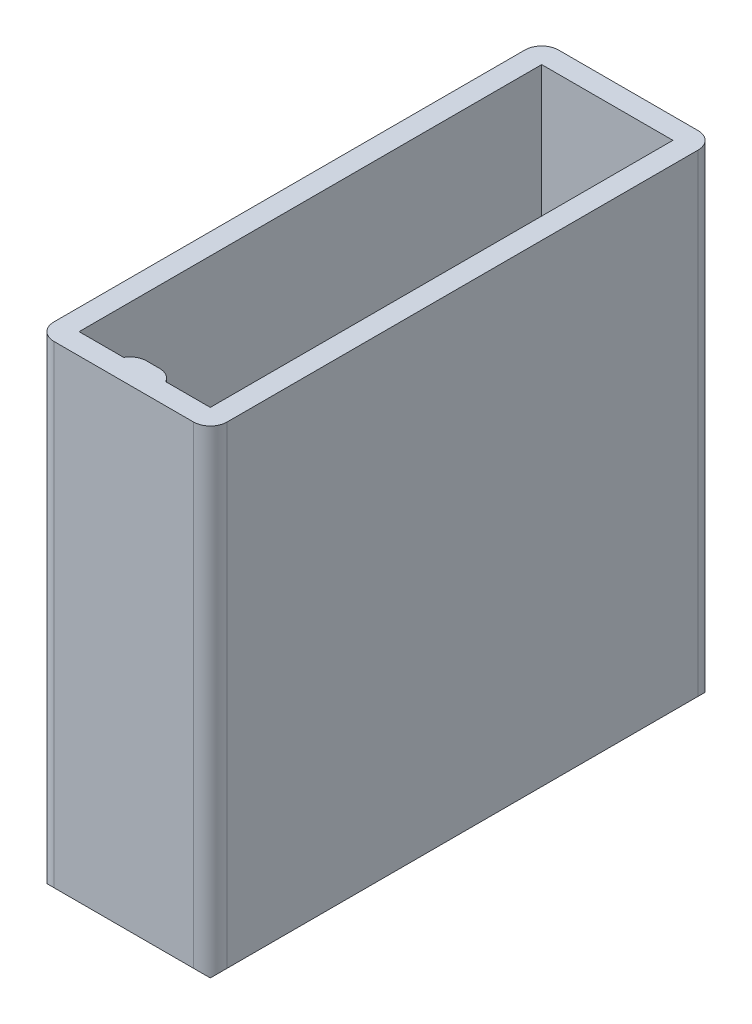
ISO-10303-21;
HEADER;
FILE_DESCRIPTION(('STEP AP214'),'2;1');
FILE_NAME('part.step','',(''),(''),'','','');
FILE_SCHEMA(('AUTOMOTIVE_DESIGN { 1 0 10303 214 1 1 1 1 }'));
ENDSEC;
DATA;
#1=APPLICATION_CONTEXT('core data for automotive mechanical design processes');
#2=APPLICATION_PROTOCOL_DEFINITION('international standard','automotive_design',2000,#1);
#3=PRODUCT_CONTEXT('',#1,'mechanical');
#4=PRODUCT('Part','Part','',(#3));
#5=PRODUCT_RELATED_PRODUCT_CATEGORY('part','',(#4));
#6=PRODUCT_DEFINITION_FORMATION('','',#4);
#7=PRODUCT_DEFINITION_CONTEXT('part definition',#1,'design');
#8=PRODUCT_DEFINITION('design','',#6,#7);
#9=PRODUCT_DEFINITION_SHAPE('','',#8);
#10=(LENGTH_UNIT() NAMED_UNIT(*) SI_UNIT(.MILLI.,.METRE.));
#11=(NAMED_UNIT(*) PLANE_ANGLE_UNIT() SI_UNIT($,.RADIAN.));
#12=(NAMED_UNIT(*) SI_UNIT($,.STERADIAN.) SOLID_ANGLE_UNIT());
#13=UNCERTAINTY_MEASURE_WITH_UNIT(LENGTH_MEASURE(1.E-05),#10,'distance_accuracy_value','');
#14=(GEOMETRIC_REPRESENTATION_CONTEXT(3) GLOBAL_UNCERTAINTY_ASSIGNED_CONTEXT((#13)) GLOBAL_UNIT_ASSIGNED_CONTEXT((#10,
#11,#12)) REPRESENTATION_CONTEXT('',''));
#15=CARTESIAN_POINT('',(0.,0.,0.));
#16=DIRECTION('',(0.,0.,1.));
#17=DIRECTION('',(1.,0.,0.));
#18=AXIS2_PLACEMENT_3D('',#15,#16,#17);
#19=CARTESIAN_POINT('',(-16.6611904761905,-28.6354761904762,34.925));
#20=DIRECTION('',(0.,0.,1.));
#21=DIRECTION('',(1.,0.,0.));
#22=AXIS2_PLACEMENT_3D('',#19,#20,#21);
#23=PLANE('',#22);
#24=DIRECTION('',(0.,-1.,0.));
#25=VECTOR('',#24,1.);
#26=CARTESIAN_POINT('',(-3.58019047619048,44.3895238095238,34.925));
#27=LINE('',#26,#25);
#28=CARTESIAN_POINT('',(-3.58019047619048,44.3895238095238,34.925));
#29=VERTEX_POINT('',#28);
#30=CARTESIAN_POINT('',(-3.58019047619048,43.6021238095238,34.925));
#31=VERTEX_POINT('',#30);
#32=EDGE_CURVE('E208',#29,#31,#27,.T.);
#33=ORIENTED_EDGE('',*,*,#32,.F.);
#34=DIRECTION('',(1.,0.,0.));
#35=VECTOR('',#34,1.);
#36=CARTESIAN_POINT('',(-16.6611904761905,44.3895238095238,34.925));
#37=LINE('',#36,#35);
#38=CARTESIAN_POINT('',(3.15080952380952,44.3895238095238,34.925));
#39=VERTEX_POINT('',#38);
#40=EDGE_CURVE('E202',#29,#39,#37,.T.);
#41=ORIENTED_EDGE('',*,*,#40,.T.);
#42=DIRECTION('',(0.,1.,0.));
#43=VECTOR('',#42,1.);
#44=CARTESIAN_POINT('',(3.15080952380954,-28.6354761904762,34.925));
#45=LINE('',#44,#43);
#46=CARTESIAN_POINT('',(3.15080952380954,-28.6354761904762,34.925));
#47=VERTEX_POINT('',#46);
#48=EDGE_CURVE('E235',#47,#39,#45,.T.);
#49=ORIENTED_EDGE('',*,*,#48,.F.);
#50=DIRECTION('',(1.,0.,0.));
#51=VECTOR('',#50,1.);
#52=CARTESIAN_POINT('',(-16.6611904761905,-28.6354761904762,34.925));
#53=LINE('',#52,#51);
#54=CARTESIAN_POINT('',(-16.6611904761905,-28.6354761904762,34.925));
#55=VERTEX_POINT('',#54);
#56=EDGE_CURVE('E218',#55,#47,#53,.T.);
#57=ORIENTED_EDGE('',*,*,#56,.F.);
#58=DIRECTION('',(0.,1.,0.));
#59=VECTOR('',#58,1.);
#60=CARTESIAN_POINT('',(-16.6611904761905,-28.6354761904762,34.925));
#61=LINE('',#60,#59);
#62=CARTESIAN_POINT('',(-16.6611904761905,44.3895238095238,34.925));
#63=VERTEX_POINT('',#62);
#64=EDGE_CURVE('E199',#55,#63,#61,.T.);
#65=ORIENTED_EDGE('',*,*,#64,.T.);
#66=CARTESIAN_POINT('',(-9.93019047619048,44.3895238095238,34.925));
#67=VERTEX_POINT('',#66);
#68=EDGE_CURVE('E188',#63,#67,#37,.T.);
#69=ORIENTED_EDGE('',*,*,#68,.T.);
#70=DIRECTION('',(0.,1.,0.));
#71=VECTOR('',#70,1.);
#72=CARTESIAN_POINT('',(-9.93019047619048,43.6021238095238,34.925));
#73=LINE('',#72,#71);
#74=CARTESIAN_POINT('',(-9.93019047619048,43.6021238095238,34.925));
#75=VERTEX_POINT('',#74);
#76=EDGE_CURVE('E197',#75,#67,#73,.T.);
#77=ORIENTED_EDGE('',*,*,#76,.F.);
#78=DIRECTION('',(-1.,0.,0.));
#79=VECTOR('',#78,1.);
#80=CARTESIAN_POINT('',(-3.58019047619048,43.6021238095238,34.925));
#81=LINE('',#80,#79);
#82=EDGE_CURVE('E204',#31,#75,#81,.T.);
#83=ORIENTED_EDGE('',*,*,#82,.F.);
#84=EDGE_LOOP('',(#33,#41,#49,#57,#65,#69,#77,#83));
#85=FACE_BOUND('',#84,.T.);
#86=ADVANCED_FACE('F44',(#85),#23,.F.);
#87=CARTESIAN_POINT('',(6.32580952380952,44.3895238095238,38.1));
#88=DIRECTION('',(0.,-1.,0.));
#89=DIRECTION('',(1.,0.,0.));
#90=AXIS2_PLACEMENT_3D('',#87,#88,#89);
#91=PLANE('',#90);
#92=ORIENTED_EDGE('',*,*,#40,.F.);
#93=CARTESIAN_POINT('',(-5.77989500180296,44.3895238095238,36.195));
#94=DIRECTION('',(0.,-1.,0.));
#95=DIRECTION('',(1.,0.,0.));
#96=AXIS2_PLACEMENT_3D('',#93,#94,#95);
#97=CIRCLE('',#96,2.54);
#98=CARTESIAN_POINT('',(-5.77989500180296,44.3895238095238,33.655));
#99=VERTEX_POINT('',#98);
#100=EDGE_CURVE('E11',#29,#99,#97,.F.);
#101=ORIENTED_EDGE('',*,*,#100,.T.);
#102=DIRECTION('',(1.,0.,0.));
#103=VECTOR('',#102,1.);
#104=CARTESIAN_POINT('',(-9.93019047619048,44.3895238095238,33.655));
#105=LINE('',#104,#103);
#106=CARTESIAN_POINT('',(-7.73048595057801,44.3895238095238,33.655));
#107=VERTEX_POINT('',#106);
#108=EDGE_CURVE('E190',#107,#99,#105,.T.);
#109=ORIENTED_EDGE('',*,*,#108,.F.);
#110=CARTESIAN_POINT('',(-7.73048595057801,44.3895238095238,36.195));
#111=DIRECTION('',(0.,-1.,0.));
#112=DIRECTION('',(1.,0.,0.));
#113=AXIS2_PLACEMENT_3D('',#110,#111,#112);
#114=CIRCLE('',#113,2.54);
#115=EDGE_CURVE('E52',#107,#67,#114,.F.);
#116=ORIENTED_EDGE('',*,*,#115,.T.);
#117=ORIENTED_EDGE('',*,*,#68,.F.);
#118=DIRECTION('',(0.,0.,1.));
#119=VECTOR('',#118,1.);
#120=CARTESIAN_POINT('',(-16.6611904761905,44.3895238095238,-34.925));
#121=LINE('',#120,#119);
#122=CARTESIAN_POINT('',(-16.6611904761905,44.3895238095238,-34.925));
#123=VERTEX_POINT('',#122);
#124=EDGE_CURVE('E227',#123,#63,#121,.T.);
#125=ORIENTED_EDGE('',*,*,#124,.F.);
#126=DIRECTION('',(-1.,0.,0.));
#127=VECTOR('',#126,1.);
#128=CARTESIAN_POINT('',(3.15080952380952,44.3895238095238,-34.925));
#129=LINE('',#128,#127);
#130=CARTESIAN_POINT('',(3.15080952380952,44.3895238095238,-34.925));
#131=VERTEX_POINT('',#130);
#132=EDGE_CURVE('E225',#131,#123,#129,.T.);
#133=ORIENTED_EDGE('',*,*,#132,.F.);
#134=DIRECTION('',(0.,0.,-1.));
#135=VECTOR('',#134,1.);
#136=CARTESIAN_POINT('',(3.15080952380952,44.3895238095238,34.925));
#137=LINE('',#136,#135);
#138=EDGE_CURVE('E201',#39,#131,#137,.T.);
#139=ORIENTED_EDGE('',*,*,#138,.F.);
#140=EDGE_LOOP('',(#92,#101,#109,#116,#117,#125,#133,#139));
#141=FACE_BOUND('',#140,.T.);
#142=DIRECTION('',(-1.,0.,0.));
#143=VECTOR('',#142,1.);
#144=CARTESIAN_POINT('',(6.32580952380952,44.3895238095238,-38.1));
#145=LINE('',#144,#143);
#146=CARTESIAN_POINT('',(3.78580952380952,44.3895238095238,-38.1));
#147=VERTEX_POINT('',#146);
#148=CARTESIAN_POINT('',(-17.2961904761905,44.3895238095238,-38.1));
#149=VERTEX_POINT('',#148);
#150=EDGE_CURVE('E234',#147,#149,#145,.T.);
#151=ORIENTED_EDGE('',*,*,#150,.T.);
#152=CARTESIAN_POINT('',(-17.2961904761905,44.3895238095238,-35.56));
#153=DIRECTION('',(0.,-1.,0.));
#154=DIRECTION('',(1.,0.,0.));
#155=AXIS2_PLACEMENT_3D('',#152,#153,#154);
#156=CIRCLE('',#155,2.54);
#157=CARTESIAN_POINT('',(-19.8361904761905,44.3895238095238,-35.56));
#158=VERTEX_POINT('',#157);
#159=EDGE_CURVE('E306',#149,#158,#156,.F.);
#160=ORIENTED_EDGE('',*,*,#159,.T.);
#161=DIRECTION('',(0.,0.,-1.));
#162=VECTOR('',#161,1.);
#163=CARTESIAN_POINT('',(-19.8361904761905,44.3895238095238,38.1));
#164=LINE('',#163,#162);
#165=CARTESIAN_POINT('',(-19.8361904761905,44.3895238095238,35.56));
#166=VERTEX_POINT('',#165);
#167=EDGE_CURVE('E249',#166,#158,#164,.T.);
#168=ORIENTED_EDGE('',*,*,#167,.F.);
#169=CARTESIAN_POINT('',(-17.2961904761905,44.3895238095238,35.56));
#170=DIRECTION('',(0.,-1.,0.));
#171=DIRECTION('',(1.,0.,0.));
#172=AXIS2_PLACEMENT_3D('',#169,#170,#171);
#173=CIRCLE('',#172,2.54);
#174=CARTESIAN_POINT('',(-17.2961904761905,44.3895238095238,38.1));
#175=VERTEX_POINT('',#174);
#176=EDGE_CURVE('E300',#166,#175,#173,.F.);
#177=ORIENTED_EDGE('',*,*,#176,.T.);
#178=DIRECTION('',(-1.,0.,0.));
#179=VECTOR('',#178,1.);
#180=CARTESIAN_POINT('',(6.32580952380952,44.3895238095238,38.1));
#181=LINE('',#180,#179);
#182=CARTESIAN_POINT('',(3.78580952380952,44.3895238095238,38.1));
#183=VERTEX_POINT('',#182);
#184=EDGE_CURVE('E241',#183,#175,#181,.T.);
#185=ORIENTED_EDGE('',*,*,#184,.F.);
#186=CARTESIAN_POINT('',(3.78580952380952,44.3895238095238,35.56));
#187=DIRECTION('',(0.,-1.,0.));
#188=DIRECTION('',(1.,0.,0.));
#189=AXIS2_PLACEMENT_3D('',#186,#187,#188);
#190=CIRCLE('',#189,2.54);
#191=CARTESIAN_POINT('',(6.32580952380952,44.3895238095238,35.56));
#192=VERTEX_POINT('',#191);
#193=EDGE_CURVE('E302',#183,#192,#190,.F.);
#194=ORIENTED_EDGE('',*,*,#193,.T.);
#195=DIRECTION('',(0.,0.,-1.));
#196=VECTOR('',#195,1.);
#197=CARTESIAN_POINT('',(6.32580952380952,44.3895238095238,38.1));
#198=LINE('',#197,#196);
#199=CARTESIAN_POINT('',(6.32580952380952,44.3895238095238,-35.56));
#200=VERTEX_POINT('',#199);
#201=EDGE_CURVE('E244',#192,#200,#198,.T.);
#202=ORIENTED_EDGE('',*,*,#201,.T.);
#203=CARTESIAN_POINT('',(3.78580952380952,44.3895238095238,-35.56));
#204=DIRECTION('',(0.,-1.,0.));
#205=DIRECTION('',(1.,0.,0.));
#206=AXIS2_PLACEMENT_3D('',#203,#204,#205);
#207=CIRCLE('',#206,2.54);
#208=EDGE_CURVE('E304',#200,#147,#207,.F.);
#209=ORIENTED_EDGE('',*,*,#208,.T.);
#210=EDGE_LOOP('',(#151,#160,#168,#177,#185,#194,#202,#209));
#211=FACE_BOUND('',#210,.T.);
#212=ADVANCED_FACE('F185',(#141,#211),#91,.F.);
#213=CARTESIAN_POINT('',(-19.8361904761905,44.3895238095238,38.1));
#214=DIRECTION('',(1.,0.,0.));
#215=DIRECTION('',(0.,0.,-1.));
#216=AXIS2_PLACEMENT_3D('',#213,#214,#215);
#217=PLANE('',#216);
#218=ORIENTED_EDGE('',*,*,#167,.T.);
#219=DIRECTION('',(0.,-1.,0.));
#220=VECTOR('',#219,1.);
#221=CARTESIAN_POINT('',(-19.8361904761905,44.3895238095238,-35.56));
#222=LINE('',#221,#220);
#223=CARTESIAN_POINT('',(-19.8361904761905,-27.0479761904762,-35.56));
#224=VERTEX_POINT('',#223);
#225=EDGE_CURVE('E285',#158,#224,#222,.T.);
#226=ORIENTED_EDGE('',*,*,#225,.T.);
#227=DIRECTION('',(0.,0.,1.));
#228=VECTOR('',#227,1.);
#229=CARTESIAN_POINT('',(-19.8361904761905,-27.0479761904762,38.1));
#230=LINE('',#229,#228);
#231=CARTESIAN_POINT('',(-19.8361904761905,-27.0479761904762,35.56));
#232=VERTEX_POINT('',#231);
#233=EDGE_CURVE('E262',#224,#232,#230,.T.);
#234=ORIENTED_EDGE('',*,*,#233,.T.);
#235=DIRECTION('',(0.,-1.,0.));
#236=VECTOR('',#235,1.);
#237=CARTESIAN_POINT('',(-19.8361904761905,44.3895238095238,35.56));
#238=LINE('',#237,#236);
#239=EDGE_CURVE('E274',#232,#166,#238,.F.);
#240=ORIENTED_EDGE('',*,*,#239,.T.);
#241=EDGE_LOOP('',(#218,#226,#234,#240));
#242=FACE_BOUND('',#241,.T.);
#243=ADVANCED_FACE('F357',(#242),#217,.F.);
#244=CARTESIAN_POINT('',(-19.8361904761905,-31.8104761904762,38.1));
#245=DIRECTION('',(0.,1.,0.));
#246=DIRECTION('',(0.,0.,1.));
#247=AXIS2_PLACEMENT_3D('',#244,#245,#246);
#248=PLANE('',#247);
#249=DIRECTION('',(-1.,0.,0.));
#250=VECTOR('',#249,1.);
#251=CARTESIAN_POINT('',(-19.8361904761905,-31.8104761904762,33.3375));
#252=LINE('',#251,#250);
#253=CARTESIAN_POINT('',(1.5633095238095,-31.8104761904762,33.3375));
#254=VERTEX_POINT('',#253);
#255=CARTESIAN_POINT('',(-15.0736904761905,-31.8104761904762,33.3375));
#256=VERTEX_POINT('',#255);
#257=EDGE_CURVE('E252',#254,#256,#252,.T.);
#258=ORIENTED_EDGE('',*,*,#257,.T.);
#259=DIRECTION('',(0.,0.,-1.));
#260=VECTOR('',#259,1.);
#261=CARTESIAN_POINT('',(-15.0736904761905,-31.8104761904762,38.1));
#262=LINE('',#261,#260);
#263=CARTESIAN_POINT('',(-15.0736904761905,-31.8104761904762,-33.3375));
#264=VERTEX_POINT('',#263);
#265=EDGE_CURVE('E259',#256,#264,#262,.T.);
#266=ORIENTED_EDGE('',*,*,#265,.T.);
#267=DIRECTION('',(1.,0.,0.));
#268=VECTOR('',#267,1.);
#269=CARTESIAN_POINT('',(-19.8361904761905,-31.8104761904762,-33.3375));
#270=LINE('',#269,#268);
#271=CARTESIAN_POINT('',(1.5633095238095,-31.8104761904762,-33.3375));
#272=VERTEX_POINT('',#271);
#273=EDGE_CURVE('E256',#264,#272,#270,.T.);
#274=ORIENTED_EDGE('',*,*,#273,.T.);
#275=DIRECTION('',(0.,0.,1.));
#276=VECTOR('',#275,1.);
#277=CARTESIAN_POINT('',(1.5633095238095,-31.8104761904762,38.1));
#278=LINE('',#277,#276);
#279=EDGE_CURVE('E254',#272,#254,#278,.T.);
#280=ORIENTED_EDGE('',*,*,#279,.T.);
#281=EDGE_LOOP('',(#258,#266,#274,#280));
#282=FACE_BOUND('',#281,.T.);
#283=ADVANCED_FACE('F383',(#282),#248,.F.);
#284=CARTESIAN_POINT('',(6.32580952380952,-31.8104761904762,38.1));
#285=DIRECTION('',(-1.,0.,0.));
#286=DIRECTION('',(0.,-1.,0.));
#287=AXIS2_PLACEMENT_3D('',#284,#285,#286);
#288=PLANE('',#287);
#289=DIRECTION('',(0.,0.,-1.));
#290=VECTOR('',#289,1.);
#291=CARTESIAN_POINT('',(6.32580952380952,-27.0479761904762,38.1));
#292=LINE('',#291,#290);
#293=CARTESIAN_POINT('',(6.32580952380952,-27.0479761904762,35.56));
#294=VERTEX_POINT('',#293);
#295=CARTESIAN_POINT('',(6.32580952380952,-27.0479761904762,-35.56));
#296=VERTEX_POINT('',#295);
#297=EDGE_CURVE('E268',#294,#296,#292,.T.);
#298=ORIENTED_EDGE('',*,*,#297,.T.);
#299=DIRECTION('',(0.,1.,0.));
#300=VECTOR('',#299,1.);
#301=CARTESIAN_POINT('',(6.32580952380952,-31.8104761904762,-35.56));
#302=LINE('',#301,#300);
#303=EDGE_CURVE('E310',#296,#200,#302,.T.);
#304=ORIENTED_EDGE('',*,*,#303,.T.);
#305=ORIENTED_EDGE('',*,*,#201,.F.);
#306=DIRECTION('',(0.,1.,0.));
#307=VECTOR('',#306,1.);
#308=CARTESIAN_POINT('',(6.32580952380952,-27.0479761904762,35.56));
#309=LINE('',#308,#307);
#310=EDGE_CURVE('E308',#192,#294,#309,.F.);
#311=ORIENTED_EDGE('',*,*,#310,.T.);
#312=EDGE_LOOP('',(#298,#304,#305,#311));
#313=FACE_BOUND('',#312,.T.);
#314=ADVANCED_FACE('F376',(#313),#288,.F.);
#315=CARTESIAN_POINT('',(0.,0.,38.1));
#316=DIRECTION('',(0.,0.,1.));
#317=DIRECTION('',(1.,0.,0.));
#318=AXIS2_PLACEMENT_3D('',#315,#316,#317);
#319=PLANE('',#318);
#320=DIRECTION('',(1.,0.,0.));
#321=VECTOR('',#320,1.);
#322=CARTESIAN_POINT('',(6.32580952380952,-27.0479761904762,38.1));
#323=LINE('',#322,#321);
#324=CARTESIAN_POINT('',(-17.2961904761905,-27.0479761904762,38.1));
#325=VERTEX_POINT('',#324);
#326=CARTESIAN_POINT('',(3.78580952380952,-27.0479761904762,38.1));
#327=VERTEX_POINT('',#326);
#328=EDGE_CURVE('E271',#325,#327,#323,.T.);
#329=ORIENTED_EDGE('',*,*,#328,.T.);
#330=DIRECTION('',(0.,1.,0.));
#331=VECTOR('',#330,1.);
#332=CARTESIAN_POINT('',(3.78580952380952,44.3895238095238,38.1));
#333=LINE('',#332,#331);
#334=EDGE_CURVE('E320',#327,#183,#333,.T.);
#335=ORIENTED_EDGE('',*,*,#334,.T.);
#336=ORIENTED_EDGE('',*,*,#184,.T.);
#337=DIRECTION('',(0.,-1.,0.));
#338=VECTOR('',#337,1.);
#339=CARTESIAN_POINT('',(-17.2961904761905,-27.0479761904762,38.1));
#340=LINE('',#339,#338);
#341=EDGE_CURVE('E317',#175,#325,#340,.T.);
#342=ORIENTED_EDGE('',*,*,#341,.T.);
#343=EDGE_LOOP('',(#329,#335,#336,#342));
#344=FACE_BOUND('',#343,.T.);
#345=ADVANCED_FACE('F373',(#344),#319,.T.);
#346=CARTESIAN_POINT('',(0.,0.,-38.1));
#347=DIRECTION('',(0.,0.,1.));
#348=DIRECTION('',(1.,0.,0.));
#349=AXIS2_PLACEMENT_3D('',#346,#347,#348);
#350=PLANE('',#349);
#351=DIRECTION('',(-1.,0.,0.));
#352=VECTOR('',#351,1.);
#353=CARTESIAN_POINT('',(0.,-27.0479761904762,-38.1));
#354=LINE('',#353,#352);
#355=CARTESIAN_POINT('',(3.78580952380952,-27.0479761904762,-38.1));
#356=VERTEX_POINT('',#355);
#357=CARTESIAN_POINT('',(-17.2961904761905,-27.0479761904762,-38.1));
#358=VERTEX_POINT('',#357);
#359=EDGE_CURVE('E265',#356,#358,#354,.T.);
#360=ORIENTED_EDGE('',*,*,#359,.T.);
#361=DIRECTION('',(0.,-1.,0.));
#362=VECTOR('',#361,1.);
#363=CARTESIAN_POINT('',(-17.2961904761905,0.,-38.1));
#364=LINE('',#363,#362);
#365=EDGE_CURVE('E298',#358,#149,#364,.F.);
#366=ORIENTED_EDGE('',*,*,#365,.T.);
#367=ORIENTED_EDGE('',*,*,#150,.F.);
#368=DIRECTION('',(0.,1.,0.));
#369=VECTOR('',#368,1.);
#370=CARTESIAN_POINT('',(3.78580952380952,0.,-38.1));
#371=LINE('',#370,#369);
#372=EDGE_CURVE('E296',#147,#356,#371,.F.);
#373=ORIENTED_EDGE('',*,*,#372,.T.);
#374=EDGE_LOOP('',(#360,#366,#367,#373));
#375=FACE_BOUND('',#374,.T.);
#376=ADVANCED_FACE('F371',(#375),#350,.F.);
#377=CARTESIAN_POINT('',(3.15080952380954,-28.6354761904762,-34.925));
#378=DIRECTION('',(0.,0.,-1.));
#379=DIRECTION('',(-1.,0.,0.));
#380=AXIS2_PLACEMENT_3D('',#377,#378,#379);
#381=PLANE('',#380);
#382=ORIENTED_EDGE('',*,*,#132,.T.);
#383=DIRECTION('',(0.,1.,0.));
#384=VECTOR('',#383,1.);
#385=CARTESIAN_POINT('',(-16.6611904761905,-28.6354761904762,-34.925));
#386=LINE('',#385,#384);
#387=CARTESIAN_POINT('',(-16.6611904761905,-28.6354761904762,-34.925));
#388=VERTEX_POINT('',#387);
#389=EDGE_CURVE('E224',#388,#123,#386,.T.);
#390=ORIENTED_EDGE('',*,*,#389,.F.);
#391=DIRECTION('',(-1.,0.,0.));
#392=VECTOR('',#391,1.);
#393=CARTESIAN_POINT('',(3.15080952380954,-28.6354761904762,-34.925));
#394=LINE('',#393,#392);
#395=CARTESIAN_POINT('',(3.15080952380954,-28.6354761904762,-34.925));
#396=VERTEX_POINT('',#395);
#397=EDGE_CURVE('E212',#396,#388,#394,.T.);
#398=ORIENTED_EDGE('',*,*,#397,.F.);
#399=DIRECTION('',(0.,1.,0.));
#400=VECTOR('',#399,1.);
#401=CARTESIAN_POINT('',(3.15080952380954,-28.6354761904762,-34.925));
#402=LINE('',#401,#400);
#403=EDGE_CURVE('E232',#396,#131,#402,.T.);
#404=ORIENTED_EDGE('',*,*,#403,.T.);
#405=EDGE_LOOP('',(#382,#390,#398,#404));
#406=FACE_BOUND('',#405,.T.);
#407=ADVANCED_FACE('F368',(#406),#381,.F.);
#408=CARTESIAN_POINT('',(3.15080952380954,-28.6354761904762,34.925));
#409=DIRECTION('',(1.,0.,0.));
#410=DIRECTION('',(0.,1.,0.));
#411=AXIS2_PLACEMENT_3D('',#408,#409,#410);
#412=PLANE('',#411);
#413=ORIENTED_EDGE('',*,*,#138,.T.);
#414=ORIENTED_EDGE('',*,*,#403,.F.);
#415=DIRECTION('',(0.,0.,-1.));
#416=VECTOR('',#415,1.);
#417=CARTESIAN_POINT('',(3.15080952380954,-28.6354761904762,34.925));
#418=LINE('',#417,#416);
#419=EDGE_CURVE('E221',#47,#396,#418,.T.);
#420=ORIENTED_EDGE('',*,*,#419,.F.);
#421=ORIENTED_EDGE('',*,*,#48,.T.);
#422=EDGE_LOOP('',(#413,#414,#420,#421));
#423=FACE_BOUND('',#422,.T.);
#424=ADVANCED_FACE('F361',(#423),#412,.F.);
#425=CARTESIAN_POINT('',(-16.6611904761905,-28.6354761904762,-34.925));
#426=DIRECTION('',(-1.,0.,0.));
#427=DIRECTION('',(0.,-1.,0.));
#428=AXIS2_PLACEMENT_3D('',#425,#426,#427);
#429=PLANE('',#428);
#430=ORIENTED_EDGE('',*,*,#124,.T.);
#431=ORIENTED_EDGE('',*,*,#64,.F.);
#432=DIRECTION('',(0.,0.,1.));
#433=VECTOR('',#432,1.);
#434=CARTESIAN_POINT('',(-16.6611904761905,-28.6354761904762,-34.925));
#435=LINE('',#434,#433);
#436=EDGE_CURVE('E215',#388,#55,#435,.T.);
#437=ORIENTED_EDGE('',*,*,#436,.F.);
#438=ORIENTED_EDGE('',*,*,#389,.T.);
#439=EDGE_LOOP('',(#430,#431,#437,#438));
#440=FACE_BOUND('',#439,.T.);
#441=ADVANCED_FACE('F363',(#440),#429,.F.);
#442=CARTESIAN_POINT('',(0.,-28.6354761904762,0.));
#443=DIRECTION('',(0.,1.,0.));
#444=DIRECTION('',(-1.,0.,0.));
#445=AXIS2_PLACEMENT_3D('',#442,#443,#444);
#446=PLANE('',#445);
#447=ORIENTED_EDGE('',*,*,#397,.T.);
#448=ORIENTED_EDGE('',*,*,#436,.T.);
#449=ORIENTED_EDGE('',*,*,#56,.T.);
#450=ORIENTED_EDGE('',*,*,#419,.T.);
#451=EDGE_LOOP('',(#447,#448,#449,#450));
#452=FACE_BOUND('',#451,.T.);
#453=ADVANCED_FACE('F366',(#452),#446,.T.);
#454=CARTESIAN_POINT('',(6.32580952380952,-27.0479761904762,38.1));
#455=DIRECTION('',(-0.707106781186547,0.707106781186549,0.));
#456=DIRECTION('',(0.,0.,-1.));
#457=AXIS2_PLACEMENT_3D('',#454,#455,#456);
#458=PLANE('',#457);
#459=DIRECTION('',(0.577350269189626,0.577350269189625,-0.577350269189626));
#460=VECTOR('',#459,1.);
#461=CARTESIAN_POINT('',(-19.0741904761905,-52.4479761904762,-12.7));
#462=LINE('',#461,#460);
#463=CARTESIAN_POINT('',(5.58186074802335,-27.7919249662624,-37.3560512242138));
#464=VERTEX_POINT('',#463);
#465=EDGE_CURVE('E280',#464,#272,#462,.F.);
#466=ORIENTED_EDGE('',*,*,#465,.F.);
#467=CARTESIAN_POINT('',(3.78580952380952,-29.5879761904762,-35.56));
#468=DIRECTION('',(-0.707106781186547,0.707106781186549,0.));
#469=DIRECTION('',(0.707106781186549,0.707106781186547,0.));
#470=AXIS2_PLACEMENT_3D('',#467,#468,#469);
#471=ELLIPSE('',#470,3.59210244842766,2.54);
#472=EDGE_CURVE('E315',#464,#296,#471,.F.);
#473=ORIENTED_EDGE('',*,*,#472,.T.);
#474=ORIENTED_EDGE('',*,*,#297,.F.);
#475=CARTESIAN_POINT('',(3.78580952380952,-29.5879761904762,35.56));
#476=DIRECTION('',(-0.707106781186547,0.707106781186549,0.));
#477=DIRECTION('',(-0.707106781186549,-0.707106781186547,0.));
#478=AXIS2_PLACEMENT_3D('',#475,#476,#477);
#479=ELLIPSE('',#478,3.59210244842766,2.54);
#480=CARTESIAN_POINT('',(5.58186074802335,-27.7919249662624,37.3560512242138));
#481=VERTEX_POINT('',#480);
#482=EDGE_CURVE('E313',#294,#481,#479,.F.);
#483=ORIENTED_EDGE('',*,*,#482,.T.);
#484=DIRECTION('',(-0.577350269189626,-0.577350269189625,-0.577350269189626));
#485=VECTOR('',#484,1.);
#486=CARTESIAN_POINT('',(4.21720634920634,-29.1565793650794,35.9913968253968));
#487=LINE('',#486,#485);
#488=EDGE_CURVE('E228',#254,#481,#487,.F.);
#489=ORIENTED_EDGE('',*,*,#488,.F.);
#490=ORIENTED_EDGE('',*,*,#279,.F.);
#491=EDGE_LOOP('',(#466,#473,#474,#483,#489,#490));
#492=FACE_BOUND('',#491,.T.);
#493=ADVANCED_FACE('F411',(#492),#458,.F.);
#494=CARTESIAN_POINT('',(0.,-27.0479761904762,38.1));
#495=DIRECTION('',(0.,-0.707106781186549,0.707106781186547));
#496=DIRECTION('',(-1.,0.,0.));
#497=AXIS2_PLACEMENT_3D('',#494,#495,#496);
#498=PLANE('',#497);
#499=ORIENTED_EDGE('',*,*,#488,.T.);
#500=CARTESIAN_POINT('',(3.78580952380952,-29.5879761904762,35.56));
#501=DIRECTION('',(0.,-0.707106781186549,0.707106781186547));
#502=DIRECTION('',(0.,-0.707106781186547,-0.707106781186549));
#503=AXIS2_PLACEMENT_3D('',#500,#501,#502);
#504=ELLIPSE('',#503,3.59210244842766,2.54);
#505=EDGE_CURVE('E325',#481,#327,#504,.T.);
#506=ORIENTED_EDGE('',*,*,#505,.T.);
#507=ORIENTED_EDGE('',*,*,#328,.F.);
#508=CARTESIAN_POINT('',(-17.2961904761905,-29.5879761904762,35.56));
#509=DIRECTION('',(0.,-0.707106781186549,0.707106781186547));
#510=DIRECTION('',(0.,0.707106781186547,0.707106781186549));
#511=AXIS2_PLACEMENT_3D('',#508,#509,#510);
#512=ELLIPSE('',#511,3.59210244842766,2.54);
#513=CARTESIAN_POINT('',(-19.0922417004043,-27.7919249662624,37.3560512242138));
#514=VERTEX_POINT('',#513);
#515=EDGE_CURVE('E323',#325,#514,#512,.T.);
#516=ORIENTED_EDGE('',*,*,#515,.T.);
#517=DIRECTION('',(-0.577350269189626,0.577350269189625,0.577350269189626));
#518=VECTOR('',#517,1.);
#519=CARTESIAN_POINT('',(-13.224126984127,-33.6600396825397,31.4879365079365));
#520=LINE('',#519,#518);
#521=EDGE_CURVE('E277',#256,#514,#520,.T.);
#522=ORIENTED_EDGE('',*,*,#521,.F.);
#523=ORIENTED_EDGE('',*,*,#257,.F.);
#524=EDGE_LOOP('',(#499,#506,#507,#516,#522,#523));
#525=FACE_BOUND('',#524,.T.);
#526=ADVANCED_FACE('F404',(#525),#498,.T.);
#527=CARTESIAN_POINT('',(-19.8361904761905,-31.8104761904762,-33.3375));
#528=DIRECTION('',(0.,0.707106781186549,0.707106781186547));
#529=DIRECTION('',(1.,0.,0.));
#530=AXIS2_PLACEMENT_3D('',#527,#528,#529);
#531=PLANE('',#530);
#532=DIRECTION('',(-0.577350269189626,0.577350269189625,-0.577350269189626));
#533=VECTOR('',#532,1.);
#534=CARTESIAN_POINT('',(-16.6611904761905,-30.2229761904762,-34.925));
#535=LINE('',#534,#533);
#536=CARTESIAN_POINT('',(-19.0922417004043,-27.7919249662624,-37.3560512242138));
#537=VERTEX_POINT('',#536);
#538=EDGE_CURVE('E275',#537,#264,#535,.F.);
#539=ORIENTED_EDGE('',*,*,#538,.F.);
#540=CARTESIAN_POINT('',(-17.2961904761905,-29.5879761904762,-35.56));
#541=DIRECTION('',(0.,0.707106781186549,0.707106781186547));
#542=DIRECTION('',(0.,-0.707106781186547,0.707106781186549));
#543=AXIS2_PLACEMENT_3D('',#540,#541,#542);
#544=ELLIPSE('',#543,3.59210244842766,2.54);
#545=EDGE_CURVE('E294',#537,#358,#544,.F.);
#546=ORIENTED_EDGE('',*,*,#545,.T.);
#547=ORIENTED_EDGE('',*,*,#359,.F.);
#548=CARTESIAN_POINT('',(3.78580952380952,-29.5879761904762,-35.56));
#549=DIRECTION('',(0.,0.707106781186549,0.707106781186547));
#550=DIRECTION('',(0.,0.707106781186547,-0.707106781186549));
#551=AXIS2_PLACEMENT_3D('',#548,#549,#550);
#552=ELLIPSE('',#551,3.59210244842766,2.54);
#553=EDGE_CURVE('E292',#356,#464,#552,.F.);
#554=ORIENTED_EDGE('',*,*,#553,.T.);
#555=ORIENTED_EDGE('',*,*,#465,.T.);
#556=ORIENTED_EDGE('',*,*,#273,.F.);
#557=EDGE_LOOP('',(#539,#546,#547,#554,#555,#556));
#558=FACE_BOUND('',#557,.T.);
#559=ADVANCED_FACE('F397',(#558),#531,.F.);
#560=CARTESIAN_POINT('',(-15.0736904761905,-31.8104761904762,38.1));
#561=DIRECTION('',(0.707106781186547,0.707106781186549,0.));
#562=DIRECTION('',(0.,0.,-1.));
#563=AXIS2_PLACEMENT_3D('',#560,#561,#562);
#564=PLANE('',#563);
#565=ORIENTED_EDGE('',*,*,#233,.F.);
#566=CARTESIAN_POINT('',(-17.2961904761905,-29.5879761904762,-35.56));
#567=DIRECTION('',(0.707106781186547,0.707106781186549,0.));
#568=DIRECTION('',(0.707106781186549,-0.707106781186547,0.));
#569=AXIS2_PLACEMENT_3D('',#566,#567,#568);
#570=ELLIPSE('',#569,3.59210244842766,2.54);
#571=EDGE_CURVE('E290',#224,#537,#570,.F.);
#572=ORIENTED_EDGE('',*,*,#571,.T.);
#573=ORIENTED_EDGE('',*,*,#538,.T.);
#574=ORIENTED_EDGE('',*,*,#265,.F.);
#575=ORIENTED_EDGE('',*,*,#521,.T.);
#576=CARTESIAN_POINT('',(-17.2961904761905,-29.5879761904762,35.56));
#577=DIRECTION('',(0.707106781186547,0.707106781186549,0.));
#578=DIRECTION('',(-0.707106781186549,0.707106781186547,0.));
#579=AXIS2_PLACEMENT_3D('',#576,#577,#578);
#580=ELLIPSE('',#579,3.59210244842766,2.54);
#581=EDGE_CURVE('E288',#514,#232,#580,.F.);
#582=ORIENTED_EDGE('',*,*,#581,.T.);
#583=EDGE_LOOP('',(#565,#572,#573,#574,#575,#582));
#584=FACE_BOUND('',#583,.T.);
#585=ADVANCED_FACE('F349',(#584),#564,.F.);
#586=CARTESIAN_POINT('',(-3.58019047619048,43.6021238095238,33.655));
#587=DIRECTION('',(0.,1.,0.));
#588=DIRECTION('',(0.,0.,1.));
#589=AXIS2_PLACEMENT_3D('',#586,#587,#588);
#590=PLANE('',#589);
#591=DIRECTION('',(-1.,0.,0.));
#592=VECTOR('',#591,1.);
#593=CARTESIAN_POINT('',(-3.58019047619048,43.6021238095238,33.655));
#594=LINE('',#593,#592);
#595=CARTESIAN_POINT('',(-5.77989500180296,43.6021238095238,33.655));
#596=VERTEX_POINT('',#595);
#597=CARTESIAN_POINT('',(-7.73048595057801,43.6021238095238,33.655));
#598=VERTEX_POINT('',#597);
#599=EDGE_CURVE('E206',#596,#598,#594,.T.);
#600=ORIENTED_EDGE('',*,*,#599,.F.);
#601=CARTESIAN_POINT('',(-5.77989500180296,43.6021238095238,36.195));
#602=DIRECTION('',(0.,1.,0.));
#603=DIRECTION('',(0.,0.,1.));
#604=AXIS2_PLACEMENT_3D('',#601,#602,#603);
#605=CIRCLE('',#604,2.54);
#606=EDGE_CURVE('E67',#596,#31,#605,.F.);
#607=ORIENTED_EDGE('',*,*,#606,.T.);
#608=ORIENTED_EDGE('',*,*,#82,.T.);
#609=CARTESIAN_POINT('',(-7.73048595057801,43.6021238095238,36.195));
#610=DIRECTION('',(0.,1.,0.));
#611=DIRECTION('',(0.,0.,1.));
#612=AXIS2_PLACEMENT_3D('',#609,#610,#611);
#613=CIRCLE('',#612,2.54);
#614=EDGE_CURVE('E59',#75,#598,#613,.F.);
#615=ORIENTED_EDGE('',*,*,#614,.T.);
#616=EDGE_LOOP('',(#600,#607,#608,#615));
#617=FACE_BOUND('',#616,.T.);
#618=ADVANCED_FACE('F332',(#617),#590,.F.);
#619=CARTESIAN_POINT('',(0.,0.,33.655));
#620=DIRECTION('',(0.,0.,-1.));
#621=DIRECTION('',(-1.,0.,0.));
#622=AXIS2_PLACEMENT_3D('',#619,#620,#621);
#623=PLANE('',#622);
#624=ORIENTED_EDGE('',*,*,#108,.T.);
#625=DIRECTION('',(0.,-1.,0.));
#626=VECTOR('',#625,1.);
#627=CARTESIAN_POINT('',(-5.77989500180296,43.6021238095238,33.655));
#628=LINE('',#627,#626);
#629=EDGE_CURVE('E329',#99,#596,#628,.T.);
#630=ORIENTED_EDGE('',*,*,#629,.T.);
#631=ORIENTED_EDGE('',*,*,#599,.T.);
#632=DIRECTION('',(0.,1.,0.));
#633=VECTOR('',#632,1.);
#634=CARTESIAN_POINT('',(-7.73048595057801,44.3895238095238,33.655));
#635=LINE('',#634,#633);
#636=EDGE_CURVE('E327',#598,#107,#635,.T.);
#637=ORIENTED_EDGE('',*,*,#636,.T.);
#638=EDGE_LOOP('',(#624,#630,#631,#637));
#639=FACE_BOUND('',#638,.T.);
#640=ADVANCED_FACE('F337',(#639),#623,.T.);
#641=CARTESIAN_POINT('',(-17.2961904761905,44.3895238095238,-35.56));
#642=DIRECTION('',(0.,-1.,0.));
#643=DIRECTION('',(0.,0.,-1.));
#644=AXIS2_PLACEMENT_3D('',#641,#642,#643);
#645=CYLINDRICAL_SURFACE('',#644,2.54);
#646=ORIENTED_EDGE('',*,*,#159,.F.);
#647=ORIENTED_EDGE('',*,*,#365,.F.);
#648=ORIENTED_EDGE('',*,*,#545,.F.);
#649=ORIENTED_EDGE('',*,*,#571,.F.);
#650=ORIENTED_EDGE('',*,*,#225,.F.);
#651=EDGE_LOOP('',(#646,#647,#648,#649,#650));
#652=FACE_BOUND('',#651,.T.);
#653=ADVANCED_FACE('F339',(#652),#645,.T.);
#654=CARTESIAN_POINT('',(3.78580952380952,-31.8104761904762,-35.56));
#655=DIRECTION('',(0.,1.,0.));
#656=DIRECTION('',(-1.,0.,0.));
#657=AXIS2_PLACEMENT_3D('',#654,#655,#656);
#658=CYLINDRICAL_SURFACE('',#657,2.54);
#659=ORIENTED_EDGE('',*,*,#553,.F.);
#660=ORIENTED_EDGE('',*,*,#372,.F.);
#661=ORIENTED_EDGE('',*,*,#208,.F.);
#662=ORIENTED_EDGE('',*,*,#303,.F.);
#663=ORIENTED_EDGE('',*,*,#472,.F.);
#664=EDGE_LOOP('',(#659,#660,#661,#662,#663));
#665=FACE_BOUND('',#664,.T.);
#666=ADVANCED_FACE('F346',(#665),#658,.T.);
#667=CARTESIAN_POINT('',(3.78580952380952,0.,35.56));
#668=DIRECTION('',(0.,-1.,0.));
#669=DIRECTION('',(1.,0.,0.));
#670=AXIS2_PLACEMENT_3D('',#667,#668,#669);
#671=CYLINDRICAL_SURFACE('',#670,2.54);
#672=ORIENTED_EDGE('',*,*,#482,.F.);
#673=ORIENTED_EDGE('',*,*,#310,.F.);
#674=ORIENTED_EDGE('',*,*,#193,.F.);
#675=ORIENTED_EDGE('',*,*,#334,.F.);
#676=ORIENTED_EDGE('',*,*,#505,.F.);
#677=EDGE_LOOP('',(#672,#673,#674,#675,#676));
#678=FACE_BOUND('',#677,.T.);
#679=ADVANCED_FACE('F420',(#678),#671,.T.);
#680=CARTESIAN_POINT('',(-17.2961904761905,0.,35.56));
#681=DIRECTION('',(0.,1.,0.));
#682=DIRECTION('',(0.,0.,1.));
#683=AXIS2_PLACEMENT_3D('',#680,#681,#682);
#684=CYLINDRICAL_SURFACE('',#683,2.54);
#685=ORIENTED_EDGE('',*,*,#176,.F.);
#686=ORIENTED_EDGE('',*,*,#239,.F.);
#687=ORIENTED_EDGE('',*,*,#581,.F.);
#688=ORIENTED_EDGE('',*,*,#515,.F.);
#689=ORIENTED_EDGE('',*,*,#341,.F.);
#690=EDGE_LOOP('',(#685,#686,#687,#688,#689));
#691=FACE_BOUND('',#690,.T.);
#692=ADVANCED_FACE('F424',(#691),#684,.T.);
#693=CARTESIAN_POINT('',(-5.77989500180296,44.3895238095238,36.195));
#694=DIRECTION('',(0.,1.,0.));
#695=DIRECTION('',(-1.,0.,0.));
#696=AXIS2_PLACEMENT_3D('',#693,#694,#695);
#697=CYLINDRICAL_SURFACE('',#696,2.54);
#698=ORIENTED_EDGE('',*,*,#100,.F.);
#699=ORIENTED_EDGE('',*,*,#32,.T.);
#700=ORIENTED_EDGE('',*,*,#606,.F.);
#701=ORIENTED_EDGE('',*,*,#629,.F.);
#702=EDGE_LOOP('',(#698,#699,#700,#701));
#703=FACE_BOUND('',#702,.T.);
#704=ADVANCED_FACE('F334',(#703),#697,.T.);
#705=CARTESIAN_POINT('',(-7.73048595057801,43.6021238095238,36.195));
#706=DIRECTION('',(0.,-1.,0.));
#707=DIRECTION('',(0.,0.,-1.));
#708=AXIS2_PLACEMENT_3D('',#705,#706,#707);
#709=CYLINDRICAL_SURFACE('',#708,2.54);
#710=ORIENTED_EDGE('',*,*,#614,.F.);
#711=ORIENTED_EDGE('',*,*,#76,.T.);
#712=ORIENTED_EDGE('',*,*,#115,.F.);
#713=ORIENTED_EDGE('',*,*,#636,.F.);
#714=EDGE_LOOP('',(#710,#711,#712,#713));
#715=FACE_BOUND('',#714,.T.);
#716=ADVANCED_FACE('F46',(#715),#709,.T.);
#717=CLOSED_SHELL('',(#86,#212,#243,#283,#314,#345,#376,#407,#424,#441,#453,#493,#526,#559,#585,
#618,#640,#653,#666,#679,#692,#704,#716));
#718=MANIFOLD_SOLID_BREP('B2',#717);
#719=ADVANCED_BREP_SHAPE_REPRESENTATION('',(#18,#718),#14);
#720=SHAPE_DEFINITION_REPRESENTATION(#9,#719);
ENDSEC;
END-ISO-10303-21;
